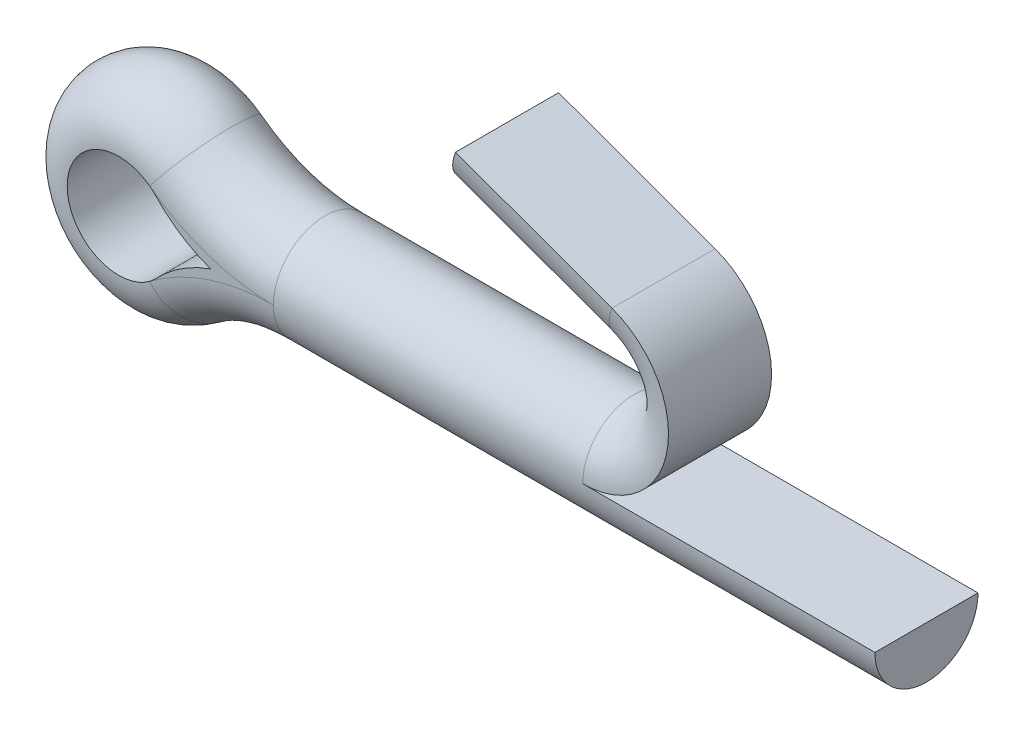
ISO-10303-21;
HEADER;
FILE_DESCRIPTION(('STEP AP214'),'2;1');
FILE_NAME('part.step','',(''),(''),'','','');
FILE_SCHEMA(('AUTOMOTIVE_DESIGN { 1 0 10303 214 1 1 1 1 }'));
ENDSEC;
DATA;
#1=APPLICATION_CONTEXT('core data for automotive mechanical design processes');
#2=APPLICATION_PROTOCOL_DEFINITION('international standard','automotive_design',2000,#1);
#3=PRODUCT_CONTEXT('',#1,'mechanical');
#4=PRODUCT('Part','Part','',(#3));
#5=PRODUCT_RELATED_PRODUCT_CATEGORY('part','',(#4));
#6=PRODUCT_DEFINITION_FORMATION('','',#4);
#7=PRODUCT_DEFINITION_CONTEXT('part definition',#1,'design');
#8=PRODUCT_DEFINITION('design','',#6,#7);
#9=PRODUCT_DEFINITION_SHAPE('','',#8);
#10=(LENGTH_UNIT() NAMED_UNIT(*) SI_UNIT(.MILLI.,.METRE.));
#11=(NAMED_UNIT(*) PLANE_ANGLE_UNIT() SI_UNIT($,.RADIAN.));
#12=(NAMED_UNIT(*) SI_UNIT($,.STERADIAN.) SOLID_ANGLE_UNIT());
#13=UNCERTAINTY_MEASURE_WITH_UNIT(LENGTH_MEASURE(1.E-05),#10,'distance_accuracy_value','');
#14=(GEOMETRIC_REPRESENTATION_CONTEXT(3) GLOBAL_UNCERTAINTY_ASSIGNED_CONTEXT((#13)) GLOBAL_UNIT_ASSIGNED_CONTEXT((#10,
#11,#12)) REPRESENTATION_CONTEXT('',''));
#15=CARTESIAN_POINT('',(0.,0.,0.));
#16=DIRECTION('',(0.,0.,1.));
#17=DIRECTION('',(1.,0.,0.));
#18=AXIS2_PLACEMENT_3D('',#15,#16,#17);
#19=CARTESIAN_POINT('',(0.,0.,1.5));
#20=DIRECTION('',(0.,0.,-1.));
#21=DIRECTION('',(-1.,0.,0.));
#22=AXIS2_PLACEMENT_3D('',#19,#20,#21);
#23=CYLINDRICAL_SURFACE('',#22,1.5);
#24=CARTESIAN_POINT('',(0.,0.,-1.5));
#25=DIRECTION('',(0.,0.,-1.));
#26=DIRECTION('',(1.,0.,0.));
#27=AXIS2_PLACEMENT_3D('',#24,#25,#26);
#28=CIRCLE('',#27,1.5);
#29=CARTESIAN_POINT('',(1.09090909090909,-1.02952287753692,-1.5));
#30=VERTEX_POINT('',#29);
#31=CARTESIAN_POINT('',(0.900000000000299,-1.19999999999978,-1.5));
#32=VERTEX_POINT('',#31);
#33=EDGE_CURVE('E151',#30,#32,#28,.T.);
#34=ORIENTED_EDGE('',*,*,#33,.T.);
#35=CARTESIAN_POINT('',(0.900000000000297,1.19999999999978,-1.5));
#36=VERTEX_POINT('',#35);
#37=EDGE_CURVE('E155',#32,#36,#28,.T.);
#38=ORIENTED_EDGE('',*,*,#37,.T.);
#39=CARTESIAN_POINT('',(1.09090909090973,1.02952287753623,-1.5));
#40=VERTEX_POINT('',#39);
#41=EDGE_CURVE('E150',#36,#40,#28,.T.);
#42=ORIENTED_EDGE('',*,*,#41,.T.);
#43=DIRECTION('',(0.,0.,-1.));
#44=VECTOR('',#43,1.);
#45=CARTESIAN_POINT('',(1.09090909090973,1.02952287753623,1.5));
#46=LINE('',#45,#44);
#47=CARTESIAN_POINT('',(1.09090909090973,1.02952287753623,1.5));
#48=VERTEX_POINT('',#47);
#49=EDGE_CURVE('E117',#48,#40,#46,.T.);
#50=ORIENTED_EDGE('',*,*,#49,.F.);
#51=CARTESIAN_POINT('',(0.,0.,1.5));
#52=DIRECTION('',(0.,0.,-1.));
#53=DIRECTION('',(1.,0.,0.));
#54=AXIS2_PLACEMENT_3D('',#51,#52,#53);
#55=CIRCLE('',#54,1.5);
#56=CARTESIAN_POINT('',(0.900000000000299,1.19999999999978,1.5));
#57=VERTEX_POINT('',#56);
#58=EDGE_CURVE('E169',#57,#48,#55,.T.);
#59=ORIENTED_EDGE('',*,*,#58,.F.);
#60=CARTESIAN_POINT('',(0.900000000000299,-1.19999999999978,1.5));
#61=VERTEX_POINT('',#60);
#62=EDGE_CURVE('E174',#61,#57,#55,.T.);
#63=ORIENTED_EDGE('',*,*,#62,.F.);
#64=CARTESIAN_POINT('',(1.09090909090909,-1.02952287753692,1.5));
#65=VERTEX_POINT('',#64);
#66=EDGE_CURVE('E170',#65,#61,#55,.T.);
#67=ORIENTED_EDGE('',*,*,#66,.F.);
#68=DIRECTION('',(0.,0.,-1.));
#69=VECTOR('',#68,1.);
#70=CARTESIAN_POINT('',(1.09090909090909,-1.02952287753692,1.5));
#71=LINE('',#70,#69);
#72=EDGE_CURVE('E113',#65,#30,#71,.T.);
#73=ORIENTED_EDGE('',*,*,#72,.T.);
#74=EDGE_LOOP('',(#34,#38,#42,#50,#59,#63,#67,#73));
#75=FACE_BOUND('',#74,.T.);
#76=ADVANCED_FACE('F17',(#75),#23,.F.);
#77=CARTESIAN_POINT('',(4.00000000001674,-3.77491721765118,1.5));
#78=DIRECTION('',(0.,0.,-1.));
#79=DIRECTION('',(-1.,0.,0.));
#80=AXIS2_PLACEMENT_3D('',#77,#78,#79);
#81=CYLINDRICAL_SURFACE('',#80,4.00000000002303);
#82=CARTESIAN_POINT('',(4.00000000001674,-3.77491721765118,-1.5));
#83=DIRECTION('',(0.,0.,1.));
#84=DIRECTION('',(1.,0.,0.));
#85=AXIS2_PLACEMENT_3D('',#82,#83,#84);
#86=CIRCLE('',#85,4.00000000002303);
#87=CARTESIAN_POINT('',(2.67712434445993,0.,-1.5));
#88=VERTEX_POINT('',#87);
#89=EDGE_CURVE('E142',#88,#30,#86,.T.);
#90=ORIENTED_EDGE('',*,*,#89,.T.);
#91=ORIENTED_EDGE('',*,*,#72,.F.);
#92=CARTESIAN_POINT('',(4.00000000001674,-3.77491721765118,1.5));
#93=DIRECTION('',(0.,0.,1.));
#94=DIRECTION('',(1.,0.,0.));
#95=AXIS2_PLACEMENT_3D('',#92,#93,#94);
#96=CIRCLE('',#95,4.00000000002303);
#97=CARTESIAN_POINT('',(2.67712434445993,0.,1.5));
#98=VERTEX_POINT('',#97);
#99=EDGE_CURVE('E163',#98,#65,#96,.T.);
#100=ORIENTED_EDGE('',*,*,#99,.F.);
#101=DIRECTION('',(0.,0.,-1.));
#102=VECTOR('',#101,1.);
#103=CARTESIAN_POINT('',(2.67712434445993,0.,1.5));
#104=LINE('',#103,#102);
#105=EDGE_CURVE('E177',#98,#88,#104,.T.);
#106=ORIENTED_EDGE('',*,*,#105,.T.);
#107=EDGE_LOOP('',(#90,#91,#100,#106));
#108=FACE_BOUND('',#107,.T.);
#109=ADVANCED_FACE('F236',(#108),#81,.T.);
#110=CARTESIAN_POINT('',(9.80238409509379,6.50626655832425,1.5));
#111=DIRECTION('',(-0.939692620785908,0.34202014332567,0.));
#112=DIRECTION('',(-0.34202014332567,-0.939692620785908,0.));
#113=AXIS2_PLACEMENT_3D('',#110,#111,#112);
#114=PLANE('',#113);
#115=DIRECTION('',(0.,0.,-1.));
#116=VECTOR('',#115,1.);
#117=CARTESIAN_POINT('',(9.80238409509379,6.50626655832425,1.5));
#118=LINE('',#117,#116);
#119=CARTESIAN_POINT('',(9.80238409509379,6.50626655832425,1.5));
#120=VERTEX_POINT('',#119);
#121=CARTESIAN_POINT('',(9.80238409509379,6.50626655832425,-1.5));
#122=VERTEX_POINT('',#121);
#123=EDGE_CURVE('E115',#120,#122,#118,.T.);
#124=ORIENTED_EDGE('',*,*,#123,.T.);
#125=CARTESIAN_POINT('',(9.80238409509379,6.50626655832425,0.));
#126=DIRECTION('',(-0.939692620785908,0.34202014332567,0.));
#127=DIRECTION('',(-0.34202014332567,-0.939692620785908,0.));
#128=AXIS2_PLACEMENT_3D('',#125,#126,#127);
#129=CIRCLE('',#128,1.5);
#130=EDGE_CURVE('E102',#122,#120,#129,.T.);
#131=ORIENTED_EDGE('',*,*,#130,.T.);
#132=EDGE_LOOP('',(#124,#131));
#133=FACE_BOUND('',#132,.T.);
#134=ADVANCED_FACE('F19',(#133),#114,.T.);
#135=CARTESIAN_POINT('',(9.80238409509378,6.50626655832425,1.5));
#136=DIRECTION('',(0.342020143325669,0.939692620785908,0.));
#137=DIRECTION('',(-0.939692620785908,0.342020143325669,0.));
#138=AXIS2_PLACEMENT_3D('',#135,#136,#137);
#139=PLANE('',#138);
#140=DIRECTION('',(0.939692620785908,-0.342020143325669,0.));
#141=VECTOR('',#140,1.);
#142=CARTESIAN_POINT('',(9.80238409509378,6.50626655832425,-1.5));
#143=LINE('',#142,#141);
#144=CARTESIAN_POINT('',(14.3550503583123,4.84923155196477,-1.5));
#145=VERTEX_POINT('',#144);
#146=EDGE_CURVE('E107',#122,#145,#143,.T.);
#147=ORIENTED_EDGE('',*,*,#146,.F.);
#148=ORIENTED_EDGE('',*,*,#123,.F.);
#149=DIRECTION('',(0.939692620785908,-0.342020143325669,0.));
#150=VECTOR('',#149,1.);
#151=CARTESIAN_POINT('',(9.80238409509378,6.50626655832425,1.5));
#152=LINE('',#151,#150);
#153=CARTESIAN_POINT('',(14.3550503583123,4.84923155196477,1.5));
#154=VERTEX_POINT('',#153);
#155=EDGE_CURVE('E109',#120,#154,#152,.T.);
#156=ORIENTED_EDGE('',*,*,#155,.T.);
#157=DIRECTION('',(0.,0.,-1.));
#158=VECTOR('',#157,1.);
#159=CARTESIAN_POINT('',(14.3550503583123,4.84923155196477,1.5));
#160=LINE('',#159,#158);
#161=EDGE_CURVE('E118',#154,#145,#160,.T.);
#162=ORIENTED_EDGE('',*,*,#161,.T.);
#163=EDGE_LOOP('',(#147,#148,#156,#162));
#164=FACE_BOUND('',#163,.T.);
#165=ADVANCED_FACE('F121',(#164),#139,.T.);
#166=CARTESIAN_POINT('',(13.4999999999981,2.5,1.5));
#167=DIRECTION('',(0.,0.,-1.));
#168=DIRECTION('',(-1.,0.,0.));
#169=AXIS2_PLACEMENT_3D('',#166,#167,#168);
#170=CYLINDRICAL_SURFACE('',#169,2.5);
#171=CARTESIAN_POINT('',(13.4999999999981,2.5,-1.5));
#172=DIRECTION('',(0.,0.,-1.));
#173=DIRECTION('',(-1.,0.,0.));
#174=AXIS2_PLACEMENT_3D('',#171,#172,#173);
#175=CIRCLE('',#174,2.5);
#176=CARTESIAN_POINT('',(13.4999999999981,0.,-1.5));
#177=VERTEX_POINT('',#176);
#178=EDGE_CURVE('E124',#145,#177,#175,.T.);
#179=ORIENTED_EDGE('',*,*,#178,.F.);
#180=ORIENTED_EDGE('',*,*,#161,.F.);
#181=CARTESIAN_POINT('',(13.4999999999981,2.5,1.5));
#182=DIRECTION('',(0.,0.,-1.));
#183=DIRECTION('',(-1.,0.,0.));
#184=AXIS2_PLACEMENT_3D('',#181,#182,#183);
#185=CIRCLE('',#184,2.5);
#186=CARTESIAN_POINT('',(13.4999999999981,0.,1.5));
#187=VERTEX_POINT('',#186);
#188=EDGE_CURVE('E157',#154,#187,#185,.T.);
#189=ORIENTED_EDGE('',*,*,#188,.T.);
#190=DIRECTION('',(0.,0.,-1.));
#191=VECTOR('',#190,1.);
#192=CARTESIAN_POINT('',(13.4999999999981,0.,1.5));
#193=LINE('',#192,#191);
#194=EDGE_CURVE('E182',#187,#177,#193,.T.);
#195=ORIENTED_EDGE('',*,*,#194,.T.);
#196=EDGE_LOOP('',(#179,#180,#189,#195));
#197=FACE_BOUND('',#196,.T.);
#198=ADVANCED_FACE('F264',(#197),#170,.T.);
#199=CARTESIAN_POINT('',(13.4999999999981,0.,1.5));
#200=DIRECTION('',(0.,1.,0.));
#201=DIRECTION('',(-1.,0.,0.));
#202=AXIS2_PLACEMENT_3D('',#199,#200,#201);
#203=PLANE('',#202);
#204=DIRECTION('',(1.,0.,0.));
#205=VECTOR('',#204,1.);
#206=CARTESIAN_POINT('',(13.4999999999981,0.,-1.5));
#207=LINE('',#206,#205);
#208=CARTESIAN_POINT('',(22.0078287868584,0.,-1.5));
#209=VERTEX_POINT('',#208);
#210=EDGE_CURVE('E132',#177,#209,#207,.T.);
#211=ORIENTED_EDGE('',*,*,#210,.F.);
#212=ORIENTED_EDGE('',*,*,#194,.F.);
#213=DIRECTION('',(1.,0.,0.));
#214=VECTOR('',#213,1.);
#215=CARTESIAN_POINT('',(13.4999999999981,0.,1.5));
#216=LINE('',#215,#214);
#217=CARTESIAN_POINT('',(22.0078287868584,0.,1.5));
#218=VERTEX_POINT('',#217);
#219=EDGE_CURVE('E160',#187,#218,#216,.T.);
#220=ORIENTED_EDGE('',*,*,#219,.T.);
#221=DIRECTION('',(0.,0.,-1.));
#222=VECTOR('',#221,1.);
#223=CARTESIAN_POINT('',(22.0078287868584,0.,1.5));
#224=LINE('',#223,#222);
#225=EDGE_CURVE('E173',#218,#209,#224,.T.);
#226=ORIENTED_EDGE('',*,*,#225,.T.);
#227=EDGE_LOOP('',(#211,#212,#220,#226));
#228=FACE_BOUND('',#227,.T.);
#229=ADVANCED_FACE('F260',(#228),#203,.T.);
#230=CARTESIAN_POINT('',(22.0078287868584,0.,1.5));
#231=DIRECTION('',(1.,0.,0.));
#232=DIRECTION('',(0.,0.,-1.));
#233=AXIS2_PLACEMENT_3D('',#230,#231,#232);
#234=PLANE('',#233);
#235=CARTESIAN_POINT('',(22.0078287868584,0.,0.));
#236=DIRECTION('',(1.,0.,0.));
#237=DIRECTION('',(0.,0.,-1.));
#238=AXIS2_PLACEMENT_3D('',#235,#236,#237);
#239=CIRCLE('',#238,1.5);
#240=CARTESIAN_POINT('',(22.0078287868584,-1.5,0.));
#241=VERTEX_POINT('',#240);
#242=EDGE_CURVE('E193',#218,#241,#239,.T.);
#243=ORIENTED_EDGE('',*,*,#242,.T.);
#244=CARTESIAN_POINT('',(22.0078287868584,0.,0.));
#245=DIRECTION('',(1.,0.,0.));
#246=DIRECTION('',(0.,0.,-1.));
#247=AXIS2_PLACEMENT_3D('',#244,#245,#246);
#248=CIRCLE('',#247,1.5);
#249=EDGE_CURVE('E11',#241,#209,#248,.T.);
#250=ORIENTED_EDGE('',*,*,#249,.T.);
#251=ORIENTED_EDGE('',*,*,#225,.F.);
#252=EDGE_LOOP('',(#243,#250,#251));
#253=FACE_BOUND('',#252,.T.);
#254=ADVANCED_FACE('F249',(#253),#234,.T.);
#255=CARTESIAN_POINT('',(4.00000000000872,3.77491721763883,1.5));
#256=DIRECTION('',(0.,0.,-1.));
#257=DIRECTION('',(-1.,0.,0.));
#258=AXIS2_PLACEMENT_3D('',#255,#256,#257);
#259=CYLINDRICAL_SURFACE('',#258,4.00000000000872);
#260=CARTESIAN_POINT('',(4.00000000000872,3.77491721763883,-1.5));
#261=DIRECTION('',(0.,0.,1.));
#262=DIRECTION('',(1.,0.,0.));
#263=AXIS2_PLACEMENT_3D('',#260,#261,#262);
#264=CIRCLE('',#263,4.00000000000872);
#265=EDGE_CURVE('E146',#40,#88,#264,.T.);
#266=ORIENTED_EDGE('',*,*,#265,.T.);
#267=ORIENTED_EDGE('',*,*,#105,.F.);
#268=CARTESIAN_POINT('',(4.00000000000872,3.77491721763883,1.5));
#269=DIRECTION('',(0.,0.,1.));
#270=DIRECTION('',(1.,0.,0.));
#271=AXIS2_PLACEMENT_3D('',#268,#269,#270);
#272=CIRCLE('',#271,4.00000000000872);
#273=EDGE_CURVE('E166',#48,#98,#272,.T.);
#274=ORIENTED_EDGE('',*,*,#273,.F.);
#275=ORIENTED_EDGE('',*,*,#49,.T.);
#276=EDGE_LOOP('',(#266,#267,#274,#275));
#277=FACE_BOUND('',#276,.T.);
#278=ADVANCED_FACE('F233',(#277),#259,.T.);
#279=CARTESIAN_POINT('',(4.49999999999814,5.99999999999441,1.5));
#280=DIRECTION('',(0.,0.,1.));
#281=DIRECTION('',(1.,0.,0.));
#282=AXIS2_PLACEMENT_3D('',#279,#280,#281);
#283=PLANE('',#282);
#284=ORIENTED_EDGE('',*,*,#66,.T.);
#285=CARTESIAN_POINT('',(4.49999999999814,-5.99999999999441,1.5));
#286=DIRECTION('',(0.,0.,1.));
#287=DIRECTION('',(1.,0.,0.));
#288=AXIS2_PLACEMENT_3D('',#285,#286,#287);
#289=CIRCLE('',#288,5.99999999999441);
#290=CARTESIAN_POINT('',(4.49999999999814,0.,1.5));
#291=VERTEX_POINT('',#290);
#292=EDGE_CURVE('E187',#61,#291,#289,.F.);
#293=ORIENTED_EDGE('',*,*,#292,.T.);
#294=CARTESIAN_POINT('',(4.49999999999814,5.99999999999441,1.5));
#295=DIRECTION('',(0.,0.,1.));
#296=DIRECTION('',(1.,0.,0.));
#297=AXIS2_PLACEMENT_3D('',#294,#295,#296);
#298=CIRCLE('',#297,5.99999999999441);
#299=EDGE_CURVE('E112',#291,#57,#298,.F.);
#300=ORIENTED_EDGE('',*,*,#299,.T.);
#301=ORIENTED_EDGE('',*,*,#58,.T.);
#302=ORIENTED_EDGE('',*,*,#273,.T.);
#303=ORIENTED_EDGE('',*,*,#99,.T.);
#304=EDGE_LOOP('',(#284,#293,#300,#301,#302,#303));
#305=FACE_BOUND('',#304,.T.);
#306=ADVANCED_FACE('F240',(#305),#283,.T.);
#307=CARTESIAN_POINT('',(4.49999999999814,5.99999999999441,-1.5));
#308=DIRECTION('',(0.,0.,1.));
#309=DIRECTION('',(1.,0.,0.));
#310=AXIS2_PLACEMENT_3D('',#307,#308,#309);
#311=PLANE('',#310);
#312=ORIENTED_EDGE('',*,*,#41,.F.);
#313=CARTESIAN_POINT('',(4.49999999999814,5.99999999999441,-1.5));
#314=DIRECTION('',(0.,0.,1.));
#315=DIRECTION('',(1.,0.,0.));
#316=AXIS2_PLACEMENT_3D('',#313,#314,#315);
#317=CIRCLE('',#316,5.99999999999441);
#318=CARTESIAN_POINT('',(4.49999999999814,0.,-1.5));
#319=VERTEX_POINT('',#318);
#320=EDGE_CURVE('E25',#36,#319,#317,.T.);
#321=ORIENTED_EDGE('',*,*,#320,.T.);
#322=CARTESIAN_POINT('',(4.49999999999814,-5.99999999999441,-1.5));
#323=DIRECTION('',(0.,0.,1.));
#324=DIRECTION('',(1.,0.,0.));
#325=AXIS2_PLACEMENT_3D('',#322,#323,#324);
#326=CIRCLE('',#325,5.99999999999441);
#327=EDGE_CURVE('E195',#319,#32,#326,.T.);
#328=ORIENTED_EDGE('',*,*,#327,.T.);
#329=ORIENTED_EDGE('',*,*,#33,.F.);
#330=ORIENTED_EDGE('',*,*,#89,.F.);
#331=ORIENTED_EDGE('',*,*,#265,.F.);
#332=EDGE_LOOP('',(#312,#321,#328,#329,#330,#331));
#333=FACE_BOUND('',#332,.T.);
#334=ADVANCED_FACE('F199',(#333),#311,.F.);
#335=CARTESIAN_POINT('',(4.49999999999814,-5.99999999999441,0.));
#336=DIRECTION('',(0.,0.,1.));
#337=DIRECTION('',(1.,0.,0.));
#338=AXIS2_PLACEMENT_3D('',#335,#336,#337);
#339=TOROIDAL_SURFACE('',#338,5.99999999999441,1.5);
#340=CARTESIAN_POINT('',(4.49999999999814,0.,0.));
#341=DIRECTION('',(1.,0.,0.));
#342=DIRECTION('',(0.,0.,-1.));
#343=AXIS2_PLACEMENT_3D('',#340,#341,#342);
#344=CIRCLE('',#343,1.5);
#345=CARTESIAN_POINT('',(4.49999999999814,-1.5,0.));
#346=VERTEX_POINT('',#345);
#347=EDGE_CURVE('E135',#291,#346,#344,.T.);
#348=ORIENTED_EDGE('',*,*,#347,.F.);
#349=ORIENTED_EDGE('',*,*,#292,.F.);
#350=CARTESIAN_POINT('',(0.900000000000298,-1.19999999999978,0.));
#351=DIRECTION('',(-0.799999999999851,-0.600000000000199,0.));
#352=DIRECTION('',(0.600000000000199,-0.799999999999851,0.));
#353=AXIS2_PLACEMENT_3D('',#350,#351,#352);
#354=CIRCLE('',#353,1.5);
#355=EDGE_CURVE('E125',#32,#61,#354,.T.);
#356=ORIENTED_EDGE('',*,*,#355,.F.);
#357=ORIENTED_EDGE('',*,*,#327,.F.);
#358=CARTESIAN_POINT('',(4.49999999999814,0.,0.));
#359=DIRECTION('',(1.,0.,0.));
#360=DIRECTION('',(0.,0.,-1.));
#361=AXIS2_PLACEMENT_3D('',#358,#359,#360);
#362=CIRCLE('',#361,1.5);
#363=EDGE_CURVE('E214',#346,#319,#362,.T.);
#364=ORIENTED_EDGE('',*,*,#363,.F.);
#365=EDGE_LOOP('',(#348,#349,#356,#357,#364));
#366=FACE_BOUND('',#365,.T.);
#367=ADVANCED_FACE('F222',(#366),#339,.T.);
#368=CARTESIAN_POINT('',(0.,0.,0.));
#369=DIRECTION('',(0.,0.,1.));
#370=DIRECTION('',(1.,0.,0.));
#371=AXIS2_PLACEMENT_3D('',#368,#369,#370);
#372=DEGENERATE_TOROIDAL_SURFACE('',#371,1.5,1.5,.T.);
#373=ORIENTED_EDGE('',*,*,#355,.T.);
#374=ORIENTED_EDGE('',*,*,#62,.T.);
#375=CARTESIAN_POINT('',(0.900000000000298,1.19999999999978,0.));
#376=DIRECTION('',(0.799999999999851,-0.600000000000199,0.));
#377=DIRECTION('',(0.600000000000199,0.799999999999851,0.));
#378=AXIS2_PLACEMENT_3D('',#375,#376,#377);
#379=CIRCLE('',#378,1.5);
#380=EDGE_CURVE('E40',#36,#57,#379,.T.);
#381=ORIENTED_EDGE('',*,*,#380,.F.);
#382=ORIENTED_EDGE('',*,*,#37,.F.);
#383=EDGE_LOOP('',(#373,#374,#381,#382));
#384=FACE_BOUND('',#383,.T.);
#385=ADVANCED_FACE('F224',(#384),#372,.T.);
#386=CARTESIAN_POINT('',(4.49999999999814,0.,0.));
#387=DIRECTION('',(-1.,0.,0.));
#388=DIRECTION('',(0.,0.,1.));
#389=AXIS2_PLACEMENT_3D('',#386,#387,#388);
#390=CYLINDRICAL_SURFACE('',#389,1.5);
#391=ORIENTED_EDGE('',*,*,#242,.F.);
#392=ORIENTED_EDGE('',*,*,#219,.F.);
#393=CARTESIAN_POINT('',(13.4999999999981,0.,0.));
#394=DIRECTION('',(1.,0.,0.));
#395=DIRECTION('',(0.,0.,-1.));
#396=AXIS2_PLACEMENT_3D('',#393,#394,#395);
#397=CIRCLE('',#396,1.5);
#398=EDGE_CURVE('E207',#177,#187,#397,.T.);
#399=ORIENTED_EDGE('',*,*,#398,.F.);
#400=ORIENTED_EDGE('',*,*,#210,.T.);
#401=ORIENTED_EDGE('',*,*,#249,.F.);
#402=DIRECTION('',(-1.,0.,0.));
#403=VECTOR('',#402,1.);
#404=CARTESIAN_POINT('',(4.49999999999814,-1.5,0.));
#405=LINE('',#404,#403);
#406=EDGE_CURVE('E190',#241,#346,#405,.T.);
#407=ORIENTED_EDGE('',*,*,#406,.T.);
#408=ORIENTED_EDGE('',*,*,#363,.T.);
#409=CARTESIAN_POINT('',(4.49999999999814,0.,0.));
#410=DIRECTION('',(1.,0.,0.));
#411=DIRECTION('',(0.,0.,-1.));
#412=AXIS2_PLACEMENT_3D('',#409,#410,#411);
#413=CIRCLE('',#412,1.5);
#414=EDGE_CURVE('E32',#319,#291,#413,.T.);
#415=ORIENTED_EDGE('',*,*,#414,.T.);
#416=ORIENTED_EDGE('',*,*,#347,.T.);
#417=ORIENTED_EDGE('',*,*,#406,.F.);
#418=EDGE_LOOP('',(#391,#392,#399,#400,#401,#407,#408,#415,#416,#417));
#419=FACE_BOUND('',#418,.T.);
#420=ADVANCED_FACE('F218',(#419),#390,.T.);
#421=CARTESIAN_POINT('',(4.49999999999814,5.99999999999441,0.));
#422=DIRECTION('',(0.,0.,1.));
#423=DIRECTION('',(1.,0.,0.));
#424=AXIS2_PLACEMENT_3D('',#421,#422,#423);
#425=TOROIDAL_SURFACE('',#424,5.99999999999441,1.5);
#426=ORIENTED_EDGE('',*,*,#380,.T.);
#427=ORIENTED_EDGE('',*,*,#299,.F.);
#428=ORIENTED_EDGE('',*,*,#414,.F.);
#429=ORIENTED_EDGE('',*,*,#320,.F.);
#430=EDGE_LOOP('',(#426,#427,#428,#429));
#431=FACE_BOUND('',#430,.T.);
#432=ADVANCED_FACE('F204',(#431),#425,.T.);
#433=CARTESIAN_POINT('',(13.4999999999981,2.5,0.));
#434=DIRECTION('',(0.,0.,1.));
#435=DIRECTION('',(1.,0.,0.));
#436=AXIS2_PLACEMENT_3D('',#433,#434,#435);
#437=TOROIDAL_SURFACE('',#436,2.5,1.5);
#438=ORIENTED_EDGE('',*,*,#398,.T.);
#439=ORIENTED_EDGE('',*,*,#188,.F.);
#440=CARTESIAN_POINT('',(14.3550503583123,4.84923155196476,0.));
#441=DIRECTION('',(-0.939692620785911,0.342020143325662,0.));
#442=DIRECTION('',(-0.342020143325662,-0.939692620785911,0.));
#443=AXIS2_PLACEMENT_3D('',#440,#441,#442);
#444=CIRCLE('',#443,1.5);
#445=EDGE_CURVE('E212',#145,#154,#444,.T.);
#446=ORIENTED_EDGE('',*,*,#445,.F.);
#447=ORIENTED_EDGE('',*,*,#178,.T.);
#448=EDGE_LOOP('',(#438,#439,#446,#447));
#449=FACE_BOUND('',#448,.T.);
#450=ADVANCED_FACE('F361',(#449),#437,.T.);
#451=CARTESIAN_POINT('',(14.3550503583123,4.84923155196477,0.));
#452=DIRECTION('',(-0.939692620785909,0.342020143325668,0.));
#453=DIRECTION('',(-0.342020143325668,-0.939692620785909,0.));
#454=AXIS2_PLACEMENT_3D('',#451,#452,#453);
#455=CYLINDRICAL_SURFACE('',#454,1.5);
#456=ORIENTED_EDGE('',*,*,#445,.T.);
#457=ORIENTED_EDGE('',*,*,#155,.F.);
#458=ORIENTED_EDGE('',*,*,#130,.F.);
#459=ORIENTED_EDGE('',*,*,#146,.T.);
#460=EDGE_LOOP('',(#456,#457,#458,#459));
#461=FACE_BOUND('',#460,.T.);
#462=ADVANCED_FACE('F105',(#461),#455,.T.);
#463=CLOSED_SHELL('',(#76,#109,#134,#165,#198,#229,#254,#278,#306,#334,#367,#385,#420,#432,#450,#462));
#464=MANIFOLD_SOLID_BREP('B1',#463);
#465=ADVANCED_BREP_SHAPE_REPRESENTATION('',(#18,#464),#14);
#466=SHAPE_DEFINITION_REPRESENTATION(#9,#465);
ENDSEC;
END-ISO-10303-21;
